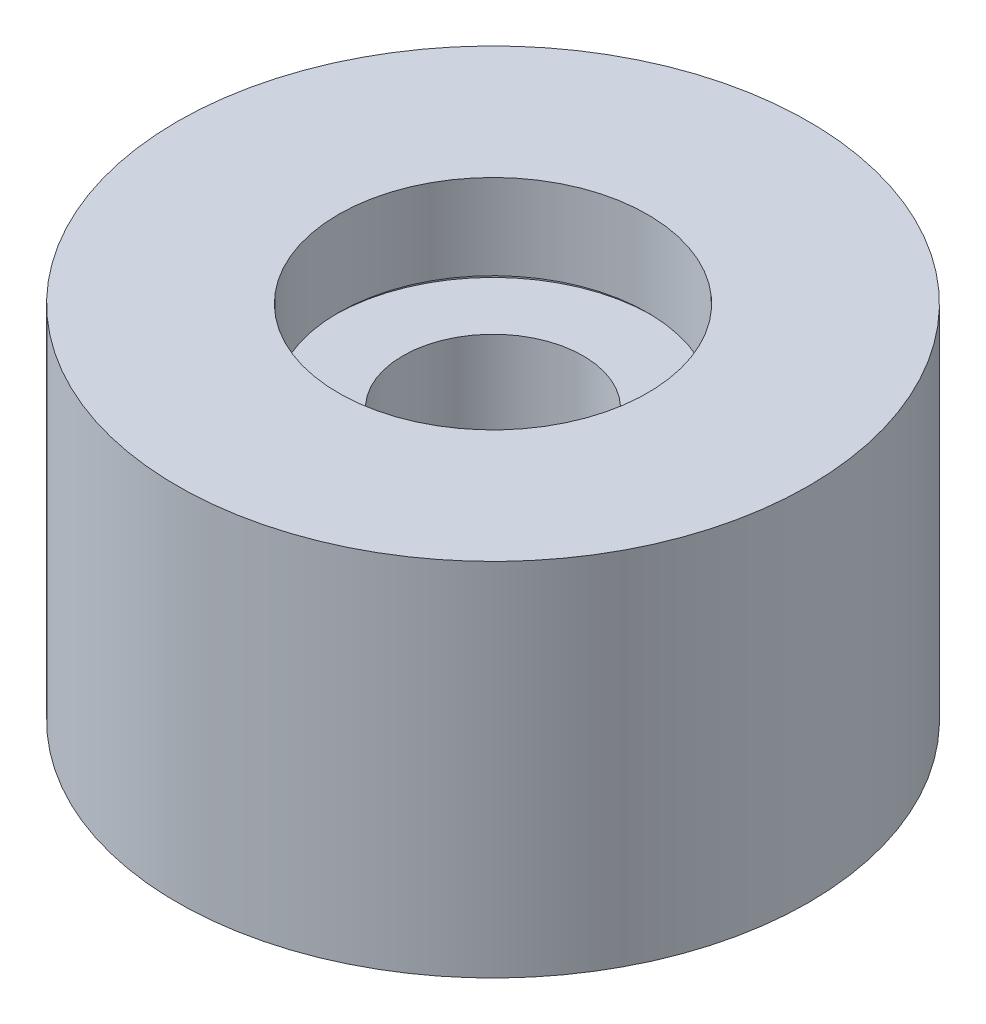
ISO-10303-21;
HEADER;
FILE_DESCRIPTION(('STEP AP214'),'2;1');
FILE_NAME('part.step','',(''),(''),'','','');
FILE_SCHEMA(('AUTOMOTIVE_DESIGN { 1 0 10303 214 1 1 1 1 }'));
ENDSEC;
DATA;
#1=APPLICATION_CONTEXT('core data for automotive mechanical design processes');
#2=APPLICATION_PROTOCOL_DEFINITION('international standard','automotive_design',2000,#1);
#3=PRODUCT_CONTEXT('',#1,'mechanical');
#4=PRODUCT('Part','Part','',(#3));
#5=PRODUCT_RELATED_PRODUCT_CATEGORY('part','',(#4));
#6=PRODUCT_DEFINITION_FORMATION('','',#4);
#7=PRODUCT_DEFINITION_CONTEXT('part definition',#1,'design');
#8=PRODUCT_DEFINITION('design','',#6,#7);
#9=PRODUCT_DEFINITION_SHAPE('','',#8);
#10=(LENGTH_UNIT() NAMED_UNIT(*) SI_UNIT(.MILLI.,.METRE.));
#11=(NAMED_UNIT(*) PLANE_ANGLE_UNIT() SI_UNIT($,.RADIAN.));
#12=(NAMED_UNIT(*) SI_UNIT($,.STERADIAN.) SOLID_ANGLE_UNIT());
#13=UNCERTAINTY_MEASURE_WITH_UNIT(LENGTH_MEASURE(1.E-05),#10,'distance_accuracy_value','');
#14=(GEOMETRIC_REPRESENTATION_CONTEXT(3) GLOBAL_UNCERTAINTY_ASSIGNED_CONTEXT((#13)) GLOBAL_UNIT_ASSIGNED_CONTEXT((#10,
#11,#12)) REPRESENTATION_CONTEXT('',''));
#15=CARTESIAN_POINT('',(0.,0.,0.));
#16=DIRECTION('',(0.,0.,1.));
#17=DIRECTION('',(1.,0.,0.));
#18=AXIS2_PLACEMENT_3D('',#15,#16,#17);
#19=CARTESIAN_POINT('',(0.,104.97462562396,0.));
#20=DIRECTION('',(0.,1.,0.));
#21=DIRECTION('',(-1.,0.,0.));
#22=AXIS2_PLACEMENT_3D('',#19,#20,#21);
#23=CYLINDRICAL_SURFACE('',#22,62.);
#24=CARTESIAN_POINT('',(0.,71.9746256239601,0.));
#25=DIRECTION('',(0.,1.,0.));
#26=DIRECTION('',(-1.,0.,0.));
#27=AXIS2_PLACEMENT_3D('',#24,#25,#26);
#28=CIRCLE('',#27,62.);
#29=CARTESIAN_POINT('',(-62.,71.9746256239601,0.));
#30=VERTEX_POINT('',#29);
#31=EDGE_CURVE('E10',#30,#30,#28,.T.);
#32=ORIENTED_EDGE('',*,*,#31,.T.);
#33=EDGE_LOOP('',(#32));
#34=FACE_BOUND('',#33,.T.);
#35=CARTESIAN_POINT('',(0.,69.9746256239601,0.));
#36=DIRECTION('',(0.,1.,0.));
#37=DIRECTION('',(-1.,0.,0.));
#38=AXIS2_PLACEMENT_3D('',#35,#36,#37);
#39=CIRCLE('',#38,62.);
#40=CARTESIAN_POINT('',(-62.,69.9746256239601,0.));
#41=VERTEX_POINT('',#40);
#42=EDGE_CURVE('E63',#41,#41,#39,.T.);
#43=ORIENTED_EDGE('',*,*,#42,.F.);
#44=EDGE_LOOP('',(#43));
#45=FACE_BOUND('',#44,.T.);
#46=ADVANCED_FACE('F35',(#34,#45),#23,.F.);
#47=CARTESIAN_POINT('',(0.,71.9746256239601,0.));
#48=DIRECTION('',(0.,-1.,0.));
#49=DIRECTION('',(1.,0.,0.));
#50=AXIS2_PLACEMENT_3D('',#47,#48,#49);
#51=PLANE('',#50);
#52=CARTESIAN_POINT('',(0.,71.9746256239601,0.));
#53=DIRECTION('',(0.,1.,0.));
#54=DIRECTION('',(-1.,0.,0.));
#55=AXIS2_PLACEMENT_3D('',#52,#53,#54);
#56=CIRCLE('',#55,60.);
#57=CARTESIAN_POINT('',(-60.,71.9746256239601,0.));
#58=VERTEX_POINT('',#57);
#59=EDGE_CURVE('E41',#58,#58,#56,.T.);
#60=ORIENTED_EDGE('',*,*,#59,.T.);
#61=EDGE_LOOP('',(#60));
#62=FACE_BOUND('',#61,.T.);
#63=ORIENTED_EDGE('',*,*,#31,.F.);
#64=EDGE_LOOP('',(#63));
#65=FACE_BOUND('',#64,.T.);
#66=ADVANCED_FACE('F70',(#62,#65),#51,.T.);
#67=CARTESIAN_POINT('',(0.,104.97462562396,0.));
#68=DIRECTION('',(0.,1.,0.));
#69=DIRECTION('',(-1.,0.,0.));
#70=AXIS2_PLACEMENT_3D('',#67,#68,#69);
#71=CYLINDRICAL_SURFACE('',#70,60.);
#72=ORIENTED_EDGE('',*,*,#59,.F.);
#73=EDGE_LOOP('',(#72));
#74=FACE_BOUND('',#73,.T.);
#75=CARTESIAN_POINT('',(0.,104.97462562396,0.));
#76=DIRECTION('',(0.,1.,0.));
#77=DIRECTION('',(-1.,0.,0.));
#78=AXIS2_PLACEMENT_3D('',#75,#76,#77);
#79=CIRCLE('',#78,60.);
#80=CARTESIAN_POINT('',(-60.,104.97462562396,0.));
#81=VERTEX_POINT('',#80);
#82=EDGE_CURVE('E45',#81,#81,#79,.T.);
#83=ORIENTED_EDGE('',*,*,#82,.T.);
#84=EDGE_LOOP('',(#83));
#85=FACE_BOUND('',#84,.T.);
#86=ADVANCED_FACE('F74',(#74,#85),#71,.F.);
#87=CARTESIAN_POINT('',(0.,104.97462562396,0.));
#88=DIRECTION('',(0.,1.,0.));
#89=DIRECTION('',(-1.,0.,0.));
#90=AXIS2_PLACEMENT_3D('',#87,#88,#89);
#91=PLANE('',#90);
#92=CARTESIAN_POINT('',(0.,104.97462562396,0.));
#93=DIRECTION('',(0.,1.,0.));
#94=DIRECTION('',(-1.,0.,0.));
#95=AXIS2_PLACEMENT_3D('',#92,#93,#94);
#96=CIRCLE('',#95,122.5);
#97=CARTESIAN_POINT('',(-122.5,104.97462562396,0.));
#98=VERTEX_POINT('',#97);
#99=EDGE_CURVE('E49',#98,#98,#96,.T.);
#100=ORIENTED_EDGE('',*,*,#99,.T.);
#101=EDGE_LOOP('',(#100));
#102=FACE_BOUND('',#101,.T.);
#103=ORIENTED_EDGE('',*,*,#82,.F.);
#104=EDGE_LOOP('',(#103));
#105=FACE_BOUND('',#104,.T.);
#106=ADVANCED_FACE('F78',(#102,#105),#91,.T.);
#107=CARTESIAN_POINT('',(0.,104.97462562396,0.));
#108=DIRECTION('',(0.,1.,0.));
#109=DIRECTION('',(-1.,0.,0.));
#110=AXIS2_PLACEMENT_3D('',#107,#108,#109);
#111=CYLINDRICAL_SURFACE('',#110,122.5);
#112=CARTESIAN_POINT('',(0.,-35.0253743760399,0.));
#113=DIRECTION('',(0.,1.,0.));
#114=DIRECTION('',(-1.,0.,0.));
#115=AXIS2_PLACEMENT_3D('',#112,#113,#114);
#116=CIRCLE('',#115,122.5);
#117=CARTESIAN_POINT('',(-122.5,-35.0253743760399,0.));
#118=VERTEX_POINT('',#117);
#119=EDGE_CURVE('E54',#118,#118,#116,.T.);
#120=ORIENTED_EDGE('',*,*,#119,.T.);
#121=EDGE_LOOP('',(#120));
#122=FACE_BOUND('',#121,.T.);
#123=ORIENTED_EDGE('',*,*,#99,.F.);
#124=EDGE_LOOP('',(#123));
#125=FACE_BOUND('',#124,.T.);
#126=ADVANCED_FACE('F85',(#122,#125),#111,.T.);
#127=CARTESIAN_POINT('',(0.,-35.0253743760399,0.));
#128=DIRECTION('',(0.,1.,0.));
#129=DIRECTION('',(-1.,0.,0.));
#130=AXIS2_PLACEMENT_3D('',#127,#128,#129);
#131=PLANE('',#130);
#132=ORIENTED_EDGE('',*,*,#119,.F.);
#133=EDGE_LOOP('',(#132));
#134=FACE_BOUND('',#133,.T.);
#135=CARTESIAN_POINT('',(0.,-35.0253743760399,0.));
#136=DIRECTION('',(0.,1.,0.));
#137=DIRECTION('',(-1.,0.,0.));
#138=AXIS2_PLACEMENT_3D('',#135,#136,#137);
#139=CIRCLE('',#138,35.);
#140=CARTESIAN_POINT('',(-35.,-35.0253743760399,0.));
#141=VERTEX_POINT('',#140);
#142=EDGE_CURVE('E57',#141,#141,#139,.T.);
#143=ORIENTED_EDGE('',*,*,#142,.T.);
#144=EDGE_LOOP('',(#143));
#145=FACE_BOUND('',#144,.T.);
#146=ADVANCED_FACE('F89',(#134,#145),#131,.F.);
#147=CARTESIAN_POINT('',(0.,104.97462562396,0.));
#148=DIRECTION('',(0.,1.,0.));
#149=DIRECTION('',(-1.,0.,0.));
#150=AXIS2_PLACEMENT_3D('',#147,#148,#149);
#151=CYLINDRICAL_SURFACE('',#150,35.);
#152=ORIENTED_EDGE('',*,*,#142,.F.);
#153=EDGE_LOOP('',(#152));
#154=FACE_BOUND('',#153,.T.);
#155=CARTESIAN_POINT('',(0.,69.9746256239601,0.));
#156=DIRECTION('',(0.,1.,0.));
#157=DIRECTION('',(-1.,0.,0.));
#158=AXIS2_PLACEMENT_3D('',#155,#156,#157);
#159=CIRCLE('',#158,35.);
#160=CARTESIAN_POINT('',(-35.,69.9746256239601,0.));
#161=VERTEX_POINT('',#160);
#162=EDGE_CURVE('E60',#161,#161,#159,.T.);
#163=ORIENTED_EDGE('',*,*,#162,.T.);
#164=EDGE_LOOP('',(#163));
#165=FACE_BOUND('',#164,.T.);
#166=ADVANCED_FACE('F93',(#154,#165),#151,.F.);
#167=CARTESIAN_POINT('',(0.,69.9746256239601,0.));
#168=DIRECTION('',(0.,-1.,0.));
#169=DIRECTION('',(1.,0.,0.));
#170=AXIS2_PLACEMENT_3D('',#167,#168,#169);
#171=PLANE('',#170);
#172=ORIENTED_EDGE('',*,*,#162,.F.);
#173=EDGE_LOOP('',(#172));
#174=FACE_BOUND('',#173,.T.);
#175=ORIENTED_EDGE('',*,*,#42,.T.);
#176=EDGE_LOOP('',(#175));
#177=FACE_BOUND('',#176,.T.);
#178=ADVANCED_FACE('F67',(#174,#177),#171,.F.);
#179=CLOSED_SHELL('',(#46,#66,#86,#106,#126,#146,#166,#178));
#180=MANIFOLD_SOLID_BREP('B2',#179);
#181=ADVANCED_BREP_SHAPE_REPRESENTATION('',(#18,#180),#14);
#182=SHAPE_DEFINITION_REPRESENTATION(#9,#181);
ENDSEC;
END-ISO-10303-21;
